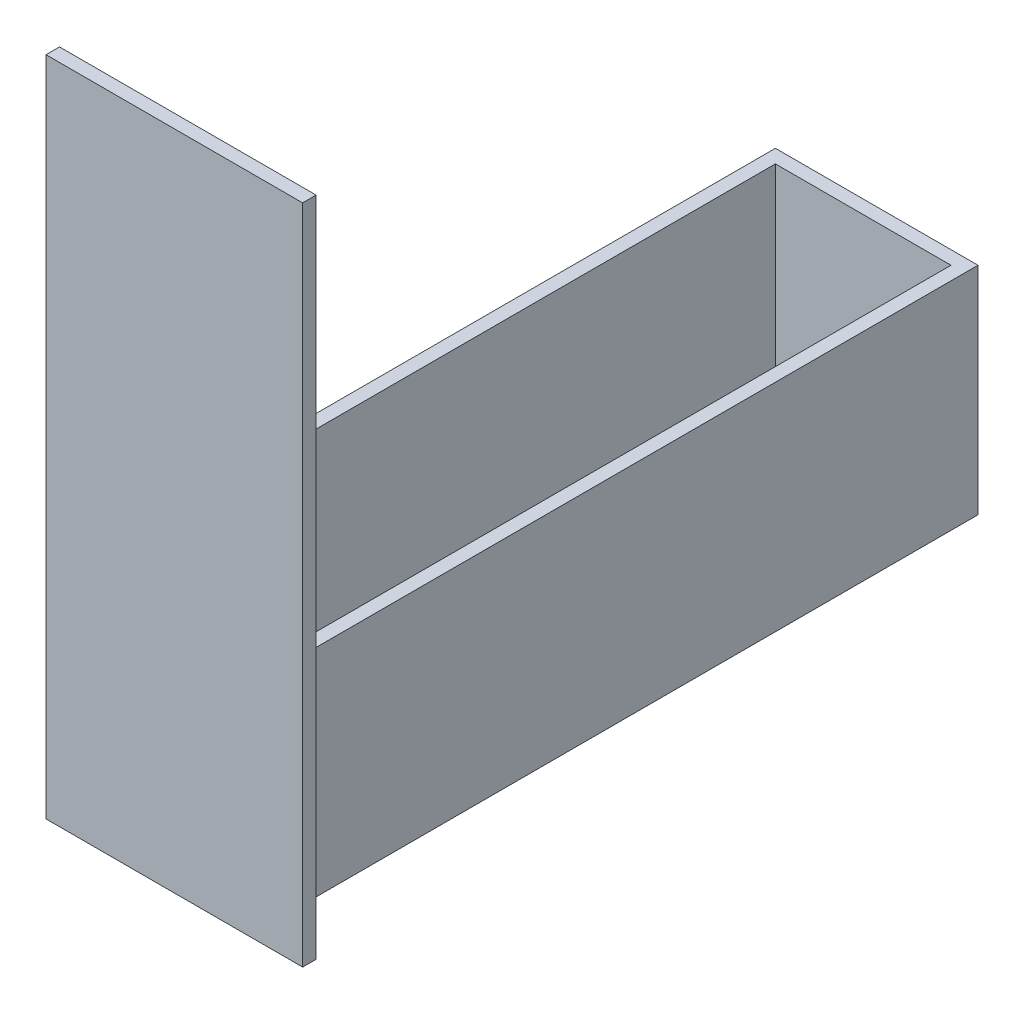
ISO-10303-21;
HEADER;
FILE_DESCRIPTION(('STEP AP214'),'2;1');
FILE_NAME('part.step','',(''),(''),'','','');
FILE_SCHEMA(('AUTOMOTIVE_DESIGN { 1 0 10303 214 1 1 1 1 }'));
ENDSEC;
DATA;
#1=APPLICATION_CONTEXT('core data for automotive mechanical design processes');
#2=APPLICATION_PROTOCOL_DEFINITION('international standard','automotive_design',2000,#1);
#3=PRODUCT_CONTEXT('',#1,'mechanical');
#4=PRODUCT('Part','Part','',(#3));
#5=PRODUCT_RELATED_PRODUCT_CATEGORY('part','',(#4));
#6=PRODUCT_DEFINITION_FORMATION('','',#4);
#7=PRODUCT_DEFINITION_CONTEXT('part definition',#1,'design');
#8=PRODUCT_DEFINITION('design','',#6,#7);
#9=PRODUCT_DEFINITION_SHAPE('','',#8);
#10=(LENGTH_UNIT() NAMED_UNIT(*) SI_UNIT(.MILLI.,.METRE.));
#11=(NAMED_UNIT(*) PLANE_ANGLE_UNIT() SI_UNIT($,.RADIAN.));
#12=(NAMED_UNIT(*) SI_UNIT($,.STERADIAN.) SOLID_ANGLE_UNIT());
#13=UNCERTAINTY_MEASURE_WITH_UNIT(LENGTH_MEASURE(1.E-05),#10,'distance_accuracy_value','');
#14=(GEOMETRIC_REPRESENTATION_CONTEXT(3) GLOBAL_UNCERTAINTY_ASSIGNED_CONTEXT((#13)) GLOBAL_UNIT_ASSIGNED_CONTEXT((#10,
#11,#12)) REPRESENTATION_CONTEXT('',''));
#15=CARTESIAN_POINT('',(0.,0.,0.));
#16=DIRECTION('',(0.,0.,1.));
#17=DIRECTION('',(1.,0.,0.));
#18=AXIS2_PLACEMENT_3D('',#15,#16,#17);
#19=CARTESIAN_POINT('',(0.,0.,0.));
#20=DIRECTION('',(0.,0.,-1.));
#21=DIRECTION('',(-1.,0.,0.));
#22=AXIS2_PLACEMENT_3D('',#19,#20,#21);
#23=PLANE('',#22);
#24=DIRECTION('',(0.,-1.,0.));
#25=VECTOR('',#24,1.);
#26=CARTESIAN_POINT('',(0.,0.,0.));
#27=LINE('',#26,#25);
#28=CARTESIAN_POINT('',(0.,490.,0.));
#29=VERTEX_POINT('',#28);
#30=CARTESIAN_POINT('',(0.,0.,0.));
#31=VERTEX_POINT('',#30);
#32=EDGE_CURVE('E236',#29,#31,#27,.T.);
#33=ORIENTED_EDGE('',*,*,#32,.F.);
#34=DIRECTION('',(-1.,0.,0.));
#35=VECTOR('',#34,1.);
#36=CARTESIAN_POINT('',(0.,490.,0.));
#37=LINE('',#36,#35);
#38=CARTESIAN_POINT('',(190.,490.,0.));
#39=VERTEX_POINT('',#38);
#40=EDGE_CURVE('E87',#39,#29,#37,.T.);
#41=ORIENTED_EDGE('',*,*,#40,.F.);
#42=DIRECTION('',(0.,1.,0.));
#43=VECTOR('',#42,1.);
#44=CARTESIAN_POINT('',(190.,0.,0.));
#45=LINE('',#44,#43);
#46=CARTESIAN_POINT('',(190.,0.,0.));
#47=VERTEX_POINT('',#46);
#48=EDGE_CURVE('E254',#47,#39,#45,.T.);
#49=ORIENTED_EDGE('',*,*,#48,.F.);
#50=DIRECTION('',(1.,0.,0.));
#51=VECTOR('',#50,1.);
#52=CARTESIAN_POINT('',(0.,0.,0.));
#53=LINE('',#52,#51);
#54=EDGE_CURVE('E251',#31,#47,#53,.T.);
#55=ORIENTED_EDGE('',*,*,#54,.F.);
#56=EDGE_LOOP('',(#33,#41,#49,#55));
#57=FACE_BOUND('',#56,.T.);
#58=DIRECTION('',(0.,-1.,0.));
#59=VECTOR('',#58,1.);
#60=CARTESIAN_POINT('',(170.,180.,0.));
#61=LINE('',#60,#59);
#62=CARTESIAN_POINT('',(170.,180.,0.));
#63=VERTEX_POINT('',#62);
#64=CARTESIAN_POINT('',(170.,20.,0.));
#65=VERTEX_POINT('',#64);
#66=EDGE_CURVE('E146',#63,#65,#61,.T.);
#67=ORIENTED_EDGE('',*,*,#66,.F.);
#68=DIRECTION('',(1.,0.,0.));
#69=VECTOR('',#68,1.);
#70=CARTESIAN_POINT('',(160.,180.,0.));
#71=LINE('',#70,#69);
#72=CARTESIAN_POINT('',(160.,180.,0.));
#73=VERTEX_POINT('',#72);
#74=EDGE_CURVE('E177',#73,#63,#71,.T.);
#75=ORIENTED_EDGE('',*,*,#74,.F.);
#76=DIRECTION('',(0.,1.,0.));
#77=VECTOR('',#76,1.);
#78=CARTESIAN_POINT('',(160.,30.,0.));
#79=LINE('',#78,#77);
#80=CARTESIAN_POINT('',(160.,30.,0.));
#81=VERTEX_POINT('',#80);
#82=EDGE_CURVE('E184',#81,#73,#79,.T.);
#83=ORIENTED_EDGE('',*,*,#82,.F.);
#84=DIRECTION('',(1.,0.,0.));
#85=VECTOR('',#84,1.);
#86=CARTESIAN_POINT('',(30.,30.0000000000001,0.));
#87=LINE('',#86,#85);
#88=CARTESIAN_POINT('',(30.,30.0000000000001,0.));
#89=VERTEX_POINT('',#88);
#90=EDGE_CURVE('E210',#89,#81,#87,.T.);
#91=ORIENTED_EDGE('',*,*,#90,.F.);
#92=DIRECTION('',(0.,-1.,0.));
#93=VECTOR('',#92,1.);
#94=CARTESIAN_POINT('',(30.,180.,0.));
#95=LINE('',#94,#93);
#96=CARTESIAN_POINT('',(30.,180.,0.));
#97=VERTEX_POINT('',#96);
#98=EDGE_CURVE('E207',#97,#89,#95,.T.);
#99=ORIENTED_EDGE('',*,*,#98,.F.);
#100=DIRECTION('',(1.,0.,0.));
#101=VECTOR('',#100,1.);
#102=CARTESIAN_POINT('',(20.,180.,0.));
#103=LINE('',#102,#101);
#104=CARTESIAN_POINT('',(20.,180.,0.));
#105=VERTEX_POINT('',#104);
#106=EDGE_CURVE('E204',#105,#97,#103,.T.);
#107=ORIENTED_EDGE('',*,*,#106,.F.);
#108=DIRECTION('',(0.,1.,0.));
#109=VECTOR('',#108,1.);
#110=CARTESIAN_POINT('',(20.,20.,0.));
#111=LINE('',#110,#109);
#112=CARTESIAN_POINT('',(20.,20.,0.));
#113=VERTEX_POINT('',#112);
#114=EDGE_CURVE('E201',#113,#105,#111,.T.);
#115=ORIENTED_EDGE('',*,*,#114,.F.);
#116=DIRECTION('',(-1.,0.,0.));
#117=VECTOR('',#116,1.);
#118=CARTESIAN_POINT('',(170.,20.,0.));
#119=LINE('',#118,#117);
#120=EDGE_CURVE('E198',#65,#113,#119,.T.);
#121=ORIENTED_EDGE('',*,*,#120,.F.);
#122=EDGE_LOOP('',(#67,#75,#83,#91,#99,#107,#115,#121));
#123=FACE_BOUND('',#122,.T.);
#124=ADVANCED_FACE('F41',(#57,#123),#23,.T.);
#125=CARTESIAN_POINT('',(0.,0.,10.));
#126=DIRECTION('',(1.,0.,0.));
#127=DIRECTION('',(0.,0.,-1.));
#128=AXIS2_PLACEMENT_3D('',#125,#126,#127);
#129=PLANE('',#128);
#130=ORIENTED_EDGE('',*,*,#32,.T.);
#131=DIRECTION('',(0.,0.,-1.));
#132=VECTOR('',#131,1.);
#133=CARTESIAN_POINT('',(0.,0.,10.));
#134=LINE('',#133,#132);
#135=CARTESIAN_POINT('',(0.,0.,10.));
#136=VERTEX_POINT('',#135);
#137=EDGE_CURVE('E11',#136,#31,#134,.T.);
#138=ORIENTED_EDGE('',*,*,#137,.F.);
#139=DIRECTION('',(0.,-1.,0.));
#140=VECTOR('',#139,1.);
#141=CARTESIAN_POINT('',(0.,0.,10.));
#142=LINE('',#141,#140);
#143=CARTESIAN_POINT('',(0.,490.,10.));
#144=VERTEX_POINT('',#143);
#145=EDGE_CURVE('E237',#144,#136,#142,.T.);
#146=ORIENTED_EDGE('',*,*,#145,.F.);
#147=DIRECTION('',(0.,0.,-1.));
#148=VECTOR('',#147,1.);
#149=CARTESIAN_POINT('',(0.,490.,10.));
#150=LINE('',#149,#148);
#151=EDGE_CURVE('E247',#144,#29,#150,.T.);
#152=ORIENTED_EDGE('',*,*,#151,.T.);
#153=EDGE_LOOP('',(#130,#138,#146,#152));
#154=FACE_BOUND('',#153,.T.);
#155=ADVANCED_FACE('F43',(#154),#129,.F.);
#156=CARTESIAN_POINT('',(0.,0.,10.));
#157=DIRECTION('',(0.,1.,0.));
#158=DIRECTION('',(0.,0.,1.));
#159=AXIS2_PLACEMENT_3D('',#156,#157,#158);
#160=PLANE('',#159);
#161=ORIENTED_EDGE('',*,*,#54,.T.);
#162=DIRECTION('',(0.,0.,-1.));
#163=VECTOR('',#162,1.);
#164=CARTESIAN_POINT('',(190.,0.,10.));
#165=LINE('',#164,#163);
#166=CARTESIAN_POINT('',(190.,0.,10.));
#167=VERTEX_POINT('',#166);
#168=EDGE_CURVE('E50',#167,#47,#165,.T.);
#169=ORIENTED_EDGE('',*,*,#168,.F.);
#170=DIRECTION('',(1.,0.,0.));
#171=VECTOR('',#170,1.);
#172=CARTESIAN_POINT('',(0.,0.,10.));
#173=LINE('',#172,#171);
#174=EDGE_CURVE('E94',#136,#167,#173,.T.);
#175=ORIENTED_EDGE('',*,*,#174,.F.);
#176=ORIENTED_EDGE('',*,*,#137,.T.);
#177=EDGE_LOOP('',(#161,#169,#175,#176));
#178=FACE_BOUND('',#177,.T.);
#179=ADVANCED_FACE('F286',(#178),#160,.F.);
#180=CARTESIAN_POINT('',(190.,0.,10.));
#181=DIRECTION('',(-1.,0.,0.));
#182=DIRECTION('',(0.,0.,1.));
#183=AXIS2_PLACEMENT_3D('',#180,#181,#182);
#184=PLANE('',#183);
#185=ORIENTED_EDGE('',*,*,#48,.T.);
#186=DIRECTION('',(0.,0.,-1.));
#187=VECTOR('',#186,1.);
#188=CARTESIAN_POINT('',(190.,490.,10.));
#189=LINE('',#188,#187);
#190=CARTESIAN_POINT('',(190.,490.,10.));
#191=VERTEX_POINT('',#190);
#192=EDGE_CURVE('E261',#191,#39,#189,.T.);
#193=ORIENTED_EDGE('',*,*,#192,.F.);
#194=DIRECTION('',(0.,1.,0.));
#195=VECTOR('',#194,1.);
#196=CARTESIAN_POINT('',(190.,0.,10.));
#197=LINE('',#196,#195);
#198=EDGE_CURVE('E242',#167,#191,#197,.T.);
#199=ORIENTED_EDGE('',*,*,#198,.F.);
#200=ORIENTED_EDGE('',*,*,#168,.T.);
#201=EDGE_LOOP('',(#185,#193,#199,#200));
#202=FACE_BOUND('',#201,.T.);
#203=ADVANCED_FACE('F268',(#202),#184,.F.);
#204=CARTESIAN_POINT('',(0.,490.,10.));
#205=DIRECTION('',(0.,-1.,0.));
#206=DIRECTION('',(0.,0.,-1.));
#207=AXIS2_PLACEMENT_3D('',#204,#205,#206);
#208=PLANE('',#207);
#209=ORIENTED_EDGE('',*,*,#40,.T.);
#210=ORIENTED_EDGE('',*,*,#151,.F.);
#211=DIRECTION('',(-1.,0.,0.));
#212=VECTOR('',#211,1.);
#213=CARTESIAN_POINT('',(0.,490.,10.));
#214=LINE('',#213,#212);
#215=EDGE_CURVE('E66',#191,#144,#214,.T.);
#216=ORIENTED_EDGE('',*,*,#215,.F.);
#217=ORIENTED_EDGE('',*,*,#192,.T.);
#218=EDGE_LOOP('',(#209,#210,#216,#217));
#219=FACE_BOUND('',#218,.T.);
#220=ADVANCED_FACE('F276',(#219),#208,.F.);
#221=CARTESIAN_POINT('',(0.,0.,10.));
#222=DIRECTION('',(0.,0.,-1.));
#223=DIRECTION('',(-1.,0.,0.));
#224=AXIS2_PLACEMENT_3D('',#221,#222,#223);
#225=PLANE('',#224);
#226=ORIENTED_EDGE('',*,*,#145,.T.);
#227=ORIENTED_EDGE('',*,*,#174,.T.);
#228=ORIENTED_EDGE('',*,*,#198,.T.);
#229=ORIENTED_EDGE('',*,*,#215,.T.);
#230=EDGE_LOOP('',(#226,#227,#228,#229));
#231=FACE_BOUND('',#230,.T.);
#232=ADVANCED_FACE('F278',(#231),#225,.F.);
#233=CARTESIAN_POINT('',(160.,180.,-500.));
#234=DIRECTION('',(0.,-1.,0.));
#235=DIRECTION('',(0.,0.,-1.));
#236=AXIS2_PLACEMENT_3D('',#233,#234,#235);
#237=PLANE('',#236);
#238=ORIENTED_EDGE('',*,*,#74,.T.);
#239=DIRECTION('',(0.,0.,1.));
#240=VECTOR('',#239,1.);
#241=CARTESIAN_POINT('',(170.,180.,-500.));
#242=LINE('',#241,#240);
#243=CARTESIAN_POINT('',(170.,180.,-510.));
#244=VERTEX_POINT('',#243);
#245=EDGE_CURVE('E150',#244,#63,#242,.T.);
#246=ORIENTED_EDGE('',*,*,#245,.F.);
#247=DIRECTION('',(1.,0.,0.));
#248=VECTOR('',#247,1.);
#249=CARTESIAN_POINT('',(170.,180.,-510.));
#250=LINE('',#249,#248);
#251=CARTESIAN_POINT('',(20.,180.,-510.));
#252=VERTEX_POINT('',#251);
#253=EDGE_CURVE('E166',#252,#244,#250,.T.);
#254=ORIENTED_EDGE('',*,*,#253,.F.);
#255=DIRECTION('',(0.,0.,1.));
#256=VECTOR('',#255,1.);
#257=CARTESIAN_POINT('',(20.,180.,-500.));
#258=LINE('',#257,#256);
#259=EDGE_CURVE('E228',#252,#105,#258,.T.);
#260=ORIENTED_EDGE('',*,*,#259,.T.);
#261=ORIENTED_EDGE('',*,*,#106,.T.);
#262=DIRECTION('',(0.,0.,1.));
#263=VECTOR('',#262,1.);
#264=CARTESIAN_POINT('',(30.,180.,-500.));
#265=LINE('',#264,#263);
#266=CARTESIAN_POINT('',(30.,180.,-500.));
#267=VERTEX_POINT('',#266);
#268=EDGE_CURVE('E224',#267,#97,#265,.T.);
#269=ORIENTED_EDGE('',*,*,#268,.F.);
#270=DIRECTION('',(1.,0.,0.));
#271=VECTOR('',#270,1.);
#272=CARTESIAN_POINT('',(170.,180.,-500.));
#273=LINE('',#272,#271);
#274=CARTESIAN_POINT('',(160.,180.,-500.));
#275=VERTEX_POINT('',#274);
#276=EDGE_CURVE('E168',#267,#275,#273,.T.);
#277=ORIENTED_EDGE('',*,*,#276,.T.);
#278=DIRECTION('',(0.,0.,1.));
#279=VECTOR('',#278,1.);
#280=CARTESIAN_POINT('',(160.,180.,-500.));
#281=LINE('',#280,#279);
#282=EDGE_CURVE('E192',#275,#73,#281,.T.);
#283=ORIENTED_EDGE('',*,*,#282,.T.);
#284=EDGE_LOOP('',(#238,#246,#254,#260,#261,#269,#277,#283));
#285=FACE_BOUND('',#284,.T.);
#286=ADVANCED_FACE('F284',(#285),#237,.F.);
#287=CARTESIAN_POINT('',(170.,180.,-500.));
#288=DIRECTION('',(-1.,0.,0.));
#289=DIRECTION('',(0.,0.,1.));
#290=AXIS2_PLACEMENT_3D('',#287,#288,#289);
#291=PLANE('',#290);
#292=ORIENTED_EDGE('',*,*,#66,.T.);
#293=DIRECTION('',(0.,0.,1.));
#294=VECTOR('',#293,1.);
#295=CARTESIAN_POINT('',(170.,20.,-500.));
#296=LINE('',#295,#294);
#297=CARTESIAN_POINT('',(170.,20.,-510.));
#298=VERTEX_POINT('',#297);
#299=EDGE_CURVE('E140',#298,#65,#296,.T.);
#300=ORIENTED_EDGE('',*,*,#299,.F.);
#301=DIRECTION('',(0.,-1.,0.));
#302=VECTOR('',#301,1.);
#303=CARTESIAN_POINT('',(170.,180.,-510.));
#304=LINE('',#303,#302);
#305=EDGE_CURVE('E144',#244,#298,#304,.T.);
#306=ORIENTED_EDGE('',*,*,#305,.F.);
#307=ORIENTED_EDGE('',*,*,#245,.T.);
#308=EDGE_LOOP('',(#292,#300,#306,#307));
#309=FACE_BOUND('',#308,.T.);
#310=ADVANCED_FACE('F142',(#309),#291,.F.);
#311=CARTESIAN_POINT('',(170.,20.,-500.));
#312=DIRECTION('',(0.,1.,0.));
#313=DIRECTION('',(0.,0.,1.));
#314=AXIS2_PLACEMENT_3D('',#311,#312,#313);
#315=PLANE('',#314);
#316=ORIENTED_EDGE('',*,*,#120,.T.);
#317=DIRECTION('',(0.,0.,1.));
#318=VECTOR('',#317,1.);
#319=CARTESIAN_POINT('',(20.,20.,-500.));
#320=LINE('',#319,#318);
#321=CARTESIAN_POINT('',(20.,20.,-510.));
#322=VERTEX_POINT('',#321);
#323=EDGE_CURVE('E151',#322,#113,#320,.T.);
#324=ORIENTED_EDGE('',*,*,#323,.F.);
#325=DIRECTION('',(-1.,0.,0.));
#326=VECTOR('',#325,1.);
#327=CARTESIAN_POINT('',(170.,20.,-510.));
#328=LINE('',#327,#326);
#329=EDGE_CURVE('E154',#298,#322,#328,.T.);
#330=ORIENTED_EDGE('',*,*,#329,.F.);
#331=ORIENTED_EDGE('',*,*,#299,.T.);
#332=EDGE_LOOP('',(#316,#324,#330,#331));
#333=FACE_BOUND('',#332,.T.);
#334=ADVANCED_FACE('F155',(#333),#315,.F.);
#335=CARTESIAN_POINT('',(20.,20.,-500.));
#336=DIRECTION('',(1.,0.,0.));
#337=DIRECTION('',(0.,0.,-1.));
#338=AXIS2_PLACEMENT_3D('',#335,#336,#337);
#339=PLANE('',#338);
#340=ORIENTED_EDGE('',*,*,#114,.T.);
#341=ORIENTED_EDGE('',*,*,#259,.F.);
#342=DIRECTION('',(0.,1.,0.));
#343=VECTOR('',#342,1.);
#344=CARTESIAN_POINT('',(20.,180.,-510.));
#345=LINE('',#344,#343);
#346=EDGE_CURVE('E161',#322,#252,#345,.T.);
#347=ORIENTED_EDGE('',*,*,#346,.F.);
#348=ORIENTED_EDGE('',*,*,#323,.T.);
#349=EDGE_LOOP('',(#340,#341,#347,#348));
#350=FACE_BOUND('',#349,.T.);
#351=ADVANCED_FACE('F301',(#350),#339,.F.);
#352=CARTESIAN_POINT('',(30.,180.,-500.));
#353=DIRECTION('',(-1.,0.,0.));
#354=DIRECTION('',(0.,-1.,0.));
#355=AXIS2_PLACEMENT_3D('',#352,#353,#354);
#356=PLANE('',#355);
#357=ORIENTED_EDGE('',*,*,#98,.T.);
#358=DIRECTION('',(0.,0.,1.));
#359=VECTOR('',#358,1.);
#360=CARTESIAN_POINT('',(30.,30.0000000000001,-500.));
#361=LINE('',#360,#359);
#362=CARTESIAN_POINT('',(30.,30.0000000000001,-500.));
#363=VERTEX_POINT('',#362);
#364=EDGE_CURVE('E220',#363,#89,#361,.T.);
#365=ORIENTED_EDGE('',*,*,#364,.F.);
#366=DIRECTION('',(0.,-1.,0.));
#367=VECTOR('',#366,1.);
#368=CARTESIAN_POINT('',(30.,180.,-500.));
#369=LINE('',#368,#367);
#370=EDGE_CURVE('E179',#267,#363,#369,.T.);
#371=ORIENTED_EDGE('',*,*,#370,.F.);
#372=ORIENTED_EDGE('',*,*,#268,.T.);
#373=EDGE_LOOP('',(#357,#365,#371,#372));
#374=FACE_BOUND('',#373,.T.);
#375=ADVANCED_FACE('F304',(#374),#356,.F.);
#376=CARTESIAN_POINT('',(30.,30.0000000000001,-500.));
#377=DIRECTION('',(0.,-1.,0.));
#378=DIRECTION('',(1.,0.,0.));
#379=AXIS2_PLACEMENT_3D('',#376,#377,#378);
#380=PLANE('',#379);
#381=ORIENTED_EDGE('',*,*,#90,.T.);
#382=DIRECTION('',(0.,0.,1.));
#383=VECTOR('',#382,1.);
#384=CARTESIAN_POINT('',(160.,30.,-500.));
#385=LINE('',#384,#383);
#386=CARTESIAN_POINT('',(160.,30.,-500.));
#387=VERTEX_POINT('',#386);
#388=EDGE_CURVE('E57',#387,#81,#385,.T.);
#389=ORIENTED_EDGE('',*,*,#388,.F.);
#390=DIRECTION('',(1.,0.,0.));
#391=VECTOR('',#390,1.);
#392=CARTESIAN_POINT('',(30.,30.0000000000001,-500.));
#393=LINE('',#392,#391);
#394=EDGE_CURVE('E183',#363,#387,#393,.T.);
#395=ORIENTED_EDGE('',*,*,#394,.F.);
#396=ORIENTED_EDGE('',*,*,#364,.T.);
#397=EDGE_LOOP('',(#381,#389,#395,#396));
#398=FACE_BOUND('',#397,.T.);
#399=ADVANCED_FACE('F308',(#398),#380,.F.);
#400=CARTESIAN_POINT('',(160.,30.,-500.));
#401=DIRECTION('',(1.,0.,0.));
#402=DIRECTION('',(0.,1.,0.));
#403=AXIS2_PLACEMENT_3D('',#400,#401,#402);
#404=PLANE('',#403);
#405=ORIENTED_EDGE('',*,*,#82,.T.);
#406=ORIENTED_EDGE('',*,*,#282,.F.);
#407=DIRECTION('',(0.,1.,0.));
#408=VECTOR('',#407,1.);
#409=CARTESIAN_POINT('',(160.,30.,-500.));
#410=LINE('',#409,#408);
#411=EDGE_CURVE('E188',#387,#275,#410,.T.);
#412=ORIENTED_EDGE('',*,*,#411,.F.);
#413=ORIENTED_EDGE('',*,*,#388,.T.);
#414=EDGE_LOOP('',(#405,#406,#412,#413));
#415=FACE_BOUND('',#414,.T.);
#416=ADVANCED_FACE('F312',(#415),#404,.F.);
#417=CARTESIAN_POINT('',(0.,0.,-500.));
#418=DIRECTION('',(0.,0.,-1.));
#419=DIRECTION('',(-1.,0.,0.));
#420=AXIS2_PLACEMENT_3D('',#417,#418,#419);
#421=PLANE('',#420);
#422=ORIENTED_EDGE('',*,*,#276,.F.);
#423=ORIENTED_EDGE('',*,*,#370,.T.);
#424=ORIENTED_EDGE('',*,*,#394,.T.);
#425=ORIENTED_EDGE('',*,*,#411,.T.);
#426=EDGE_LOOP('',(#422,#423,#424,#425));
#427=FACE_BOUND('',#426,.T.);
#428=ADVANCED_FACE('F316',(#427),#421,.F.);
#429=CARTESIAN_POINT('',(0.,0.,-510.));
#430=DIRECTION('',(0.,0.,-1.));
#431=DIRECTION('',(-1.,0.,0.));
#432=AXIS2_PLACEMENT_3D('',#429,#430,#431);
#433=PLANE('',#432);
#434=ORIENTED_EDGE('',*,*,#305,.T.);
#435=ORIENTED_EDGE('',*,*,#329,.T.);
#436=ORIENTED_EDGE('',*,*,#346,.T.);
#437=ORIENTED_EDGE('',*,*,#253,.T.);
#438=EDGE_LOOP('',(#434,#435,#436,#437));
#439=FACE_BOUND('',#438,.T.);
#440=ADVANCED_FACE('F164',(#439),#433,.T.);
#441=CLOSED_SHELL('',(#124,#155,#179,#203,#220,#232,#286,#310,#334,#351,#375,#399,#416,#428,#440));
#442=MANIFOLD_SOLID_BREP('B2',#441);
#443=ADVANCED_BREP_SHAPE_REPRESENTATION('',(#18,#442),#14);
#444=SHAPE_DEFINITION_REPRESENTATION(#9,#443);
ENDSEC;
END-ISO-10303-21;
